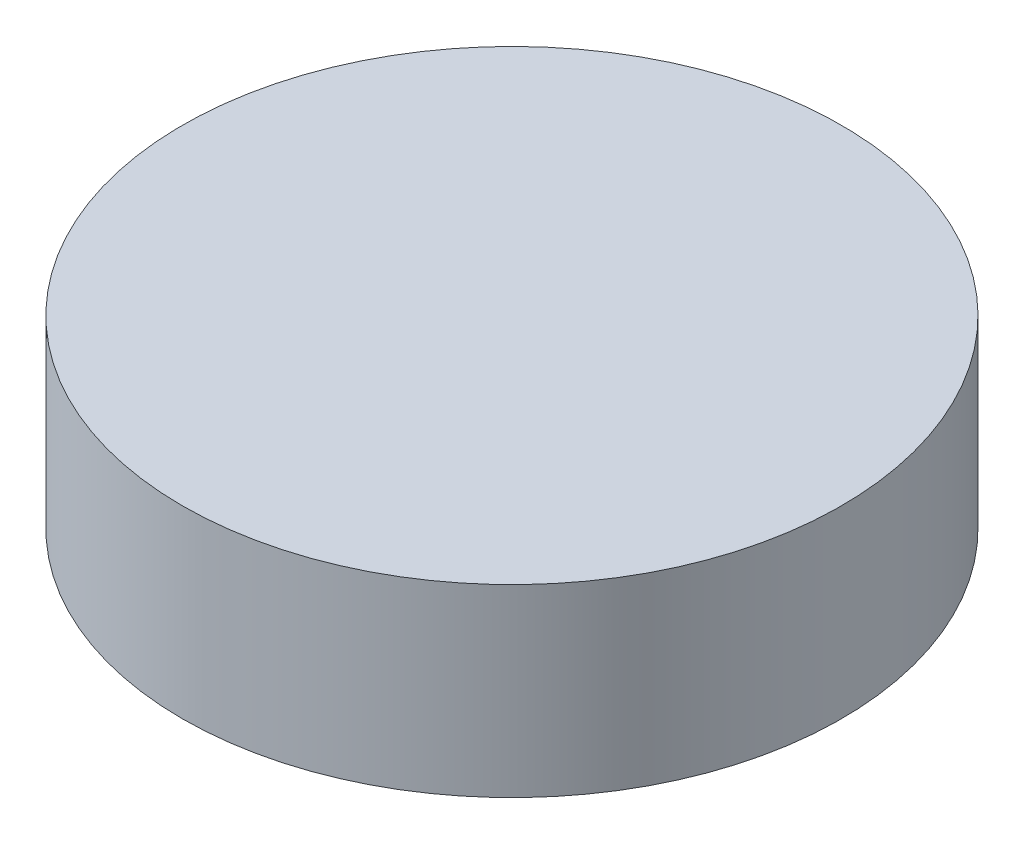
ISO-10303-21;
HEADER;
FILE_DESCRIPTION(('STEP AP214'),'2;1');
FILE_NAME('part.step','',(''),(''),'','','');
FILE_SCHEMA(('AUTOMOTIVE_DESIGN { 1 0 10303 214 1 1 1 1 }'));
ENDSEC;
DATA;
#1=APPLICATION_CONTEXT('core data for automotive mechanical design processes');
#2=APPLICATION_PROTOCOL_DEFINITION('international standard','automotive_design',2000,#1);
#3=PRODUCT_CONTEXT('',#1,'mechanical');
#4=PRODUCT('Part','Part','',(#3));
#5=PRODUCT_RELATED_PRODUCT_CATEGORY('part','',(#4));
#6=PRODUCT_DEFINITION_FORMATION('','',#4);
#7=PRODUCT_DEFINITION_CONTEXT('part definition',#1,'design');
#8=PRODUCT_DEFINITION('design','',#6,#7);
#9=PRODUCT_DEFINITION_SHAPE('','',#8);
#10=(LENGTH_UNIT() NAMED_UNIT(*) SI_UNIT(.MILLI.,.METRE.));
#11=(NAMED_UNIT(*) PLANE_ANGLE_UNIT() SI_UNIT($,.RADIAN.));
#12=(NAMED_UNIT(*) SI_UNIT($,.STERADIAN.) SOLID_ANGLE_UNIT());
#13=UNCERTAINTY_MEASURE_WITH_UNIT(LENGTH_MEASURE(1.E-05),#10,'distance_accuracy_value','');
#14=(GEOMETRIC_REPRESENTATION_CONTEXT(3) GLOBAL_UNCERTAINTY_ASSIGNED_CONTEXT((#13)) GLOBAL_UNIT_ASSIGNED_CONTEXT((#10,
#11,#12)) REPRESENTATION_CONTEXT('',''));
#15=CARTESIAN_POINT('',(0.,0.,0.));
#16=DIRECTION('',(0.,0.,1.));
#17=DIRECTION('',(1.,0.,0.));
#18=AXIS2_PLACEMENT_3D('',#15,#16,#17);
#19=CARTESIAN_POINT('',(0.,0.89,0.));
#20=DIRECTION('',(0.,-1.,0.));
#21=DIRECTION('',(0.,0.,-1.));
#22=AXIS2_PLACEMENT_3D('',#19,#20,#21);
#23=CYLINDRICAL_SURFACE('',#22,1.59);
#24=CARTESIAN_POINT('',(0.,0.89,0.));
#25=DIRECTION('',(0.,1.,0.));
#26=DIRECTION('',(0.,0.,1.));
#27=AXIS2_PLACEMENT_3D('',#24,#25,#26);
#28=CIRCLE('',#27,1.59);
#29=CARTESIAN_POINT('',(0.,0.89,1.59));
#30=VERTEX_POINT('',#29);
#31=EDGE_CURVE('E10',#30,#30,#28,.T.);
#32=ORIENTED_EDGE('',*,*,#31,.F.);
#33=EDGE_LOOP('',(#32));
#34=FACE_BOUND('',#33,.T.);
#35=CARTESIAN_POINT('',(0.,0.,0.));
#36=DIRECTION('',(0.,1.,0.));
#37=DIRECTION('',(0.,0.,1.));
#38=AXIS2_PLACEMENT_3D('',#35,#36,#37);
#39=CIRCLE('',#38,1.59);
#40=CARTESIAN_POINT('',(0.,0.,1.59));
#41=VERTEX_POINT('',#40);
#42=EDGE_CURVE('E46',#41,#41,#39,.T.);
#43=ORIENTED_EDGE('',*,*,#42,.T.);
#44=EDGE_LOOP('',(#43));
#45=FACE_BOUND('',#44,.T.);
#46=ADVANCED_FACE('F43',(#34,#45),#23,.T.);
#47=CARTESIAN_POINT('',(0.,0.89,0.));
#48=DIRECTION('',(0.,1.,0.));
#49=DIRECTION('',(0.,0.,1.));
#50=AXIS2_PLACEMENT_3D('',#47,#48,#49);
#51=PLANE('',#50);
#52=ORIENTED_EDGE('',*,*,#31,.T.);
#53=EDGE_LOOP('',(#52));
#54=FACE_BOUND('',#53,.T.);
#55=ADVANCED_FACE('F60',(#54),#51,.T.);
#56=CARTESIAN_POINT('',(0.,0.,0.));
#57=DIRECTION('',(0.,1.,0.));
#58=DIRECTION('',(0.,0.,1.));
#59=AXIS2_PLACEMENT_3D('',#56,#57,#58);
#60=PLANE('',#59);
#61=ORIENTED_EDGE('',*,*,#42,.F.);
#62=EDGE_LOOP('',(#61));
#63=FACE_BOUND('',#62,.T.);
#64=ADVANCED_FACE('F58',(#63),#60,.F.);
#65=CLOSED_SHELL('',(#46,#55,#64));
#66=MANIFOLD_SOLID_BREP('B2',#65);
#67=ADVANCED_BREP_SHAPE_REPRESENTATION('',(#18,#66),#14);
#68=SHAPE_DEFINITION_REPRESENTATION(#9,#67);
ENDSEC;
END-ISO-10303-21;
